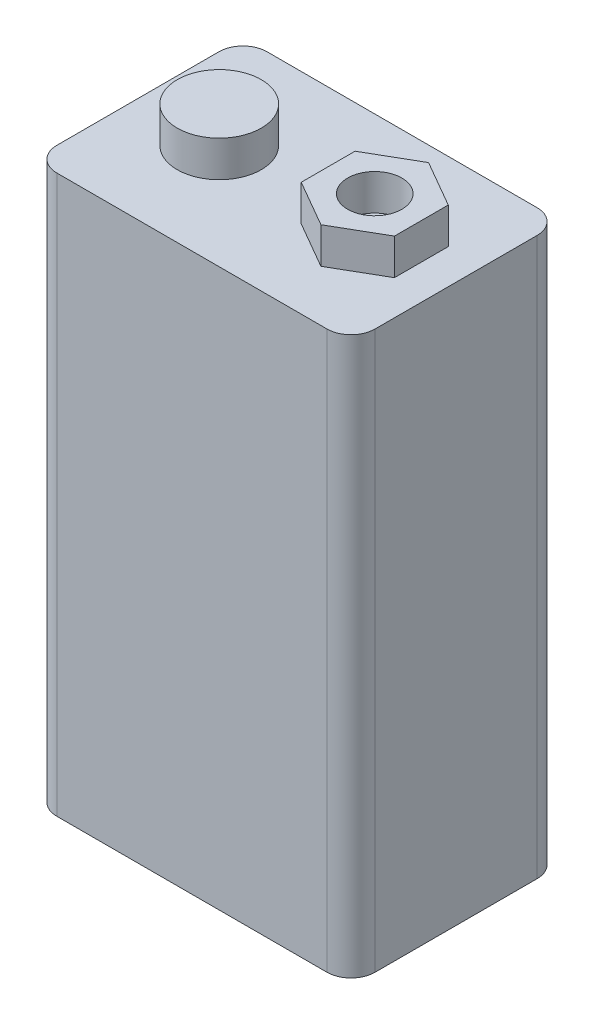
ISO-10303-21;
HEADER;
FILE_DESCRIPTION(('STEP AP214'),'2;1');
FILE_NAME('part.step','',(''),(''),'','','');
FILE_SCHEMA(('AUTOMOTIVE_DESIGN { 1 0 10303 214 1 1 1 1 }'));
ENDSEC;
DATA;
#1=APPLICATION_CONTEXT('core data for automotive mechanical design processes');
#2=APPLICATION_PROTOCOL_DEFINITION('international standard','automotive_design',2000,#1);
#3=PRODUCT_CONTEXT('',#1,'mechanical');
#4=PRODUCT('Part','Part','',(#3));
#5=PRODUCT_RELATED_PRODUCT_CATEGORY('part','',(#4));
#6=PRODUCT_DEFINITION_FORMATION('','',#4);
#7=PRODUCT_DEFINITION_CONTEXT('part definition',#1,'design');
#8=PRODUCT_DEFINITION('design','',#6,#7);
#9=PRODUCT_DEFINITION_SHAPE('','',#8);
#10=(LENGTH_UNIT() NAMED_UNIT(*) SI_UNIT(.MILLI.,.METRE.));
#11=(NAMED_UNIT(*) PLANE_ANGLE_UNIT() SI_UNIT($,.RADIAN.));
#12=(NAMED_UNIT(*) SI_UNIT($,.STERADIAN.) SOLID_ANGLE_UNIT());
#13=UNCERTAINTY_MEASURE_WITH_UNIT(LENGTH_MEASURE(1.E-05),#10,'distance_accuracy_value','');
#14=(GEOMETRIC_REPRESENTATION_CONTEXT(3) GLOBAL_UNCERTAINTY_ASSIGNED_CONTEXT((#13)) GLOBAL_UNIT_ASSIGNED_CONTEXT((#10,
#11,#12)) REPRESENTATION_CONTEXT('',''));
#15=CARTESIAN_POINT('',(0.,0.,0.));
#16=DIRECTION('',(0.,0.,1.));
#17=DIRECTION('',(1.,0.,0.));
#18=AXIS2_PLACEMENT_3D('',#15,#16,#17);
#19=CARTESIAN_POINT('',(11.25,46.4,6.75));
#20=DIRECTION('',(0.,1.,0.));
#21=DIRECTION('',(0.,0.,1.));
#22=AXIS2_PLACEMENT_3D('',#19,#20,#21);
#23=PLANE('',#22);
#24=CARTESIAN_POINT('',(-6.475,46.4,0.));
#25=DIRECTION('',(0.,1.,0.));
#26=DIRECTION('',(0.,0.,1.));
#27=AXIS2_PLACEMENT_3D('',#24,#25,#26);
#28=CIRCLE('',#27,3.5);
#29=CARTESIAN_POINT('',(-6.475,46.4,3.5));
#30=VERTEX_POINT('',#29);
#31=EDGE_CURVE('E229',#30,#30,#28,.T.);
#32=ORIENTED_EDGE('',*,*,#31,.F.);
#33=EDGE_LOOP('',(#32));
#34=FACE_BOUND('',#33,.T.);
#35=CARTESIAN_POINT('',(11.25,46.4,6.75));
#36=DIRECTION('',(0.,1.,0.));
#37=DIRECTION('',(0.,0.,1.));
#38=AXIS2_PLACEMENT_3D('',#35,#36,#37);
#39=CIRCLE('',#38,2.);
#40=CARTESIAN_POINT('',(11.25,46.4,8.75));
#41=VERTEX_POINT('',#40);
#42=CARTESIAN_POINT('',(13.25,46.4,6.74999999999999));
#43=VERTEX_POINT('',#42);
#44=EDGE_CURVE('E180',#41,#43,#39,.T.);
#45=ORIENTED_EDGE('',*,*,#44,.T.);
#46=DIRECTION('',(0.,0.,-1.));
#47=VECTOR('',#46,1.);
#48=CARTESIAN_POINT('',(13.25,46.4,6.74999999999999));
#49=LINE('',#48,#47);
#50=CARTESIAN_POINT('',(13.25,46.4,-6.74999999999999));
#51=VERTEX_POINT('',#50);
#52=EDGE_CURVE('E108',#43,#51,#49,.T.);
#53=ORIENTED_EDGE('',*,*,#52,.T.);
#54=CARTESIAN_POINT('',(11.25,46.4,-6.75));
#55=DIRECTION('',(0.,1.,0.));
#56=DIRECTION('',(0.,0.,-1.));
#57=AXIS2_PLACEMENT_3D('',#54,#55,#56);
#58=CIRCLE('',#57,2.);
#59=CARTESIAN_POINT('',(11.25,46.4,-8.75));
#60=VERTEX_POINT('',#59);
#61=EDGE_CURVE('E219',#51,#60,#58,.T.);
#62=ORIENTED_EDGE('',*,*,#61,.T.);
#63=DIRECTION('',(-1.,0.,0.));
#64=VECTOR('',#63,1.);
#65=CARTESIAN_POINT('',(-11.25,46.4,-8.75));
#66=LINE('',#65,#64);
#67=CARTESIAN_POINT('',(-11.25,46.4,-8.75));
#68=VERTEX_POINT('',#67);
#69=EDGE_CURVE('E217',#60,#68,#66,.T.);
#70=ORIENTED_EDGE('',*,*,#69,.T.);
#71=CARTESIAN_POINT('',(-11.25,46.4,-6.75));
#72=DIRECTION('',(0.,1.,0.));
#73=DIRECTION('',(0.,0.,-1.));
#74=AXIS2_PLACEMENT_3D('',#71,#72,#73);
#75=CIRCLE('',#74,2.);
#76=CARTESIAN_POINT('',(-13.25,46.4,-6.74999999999999));
#77=VERTEX_POINT('',#76);
#78=EDGE_CURVE('E131',#68,#77,#75,.T.);
#79=ORIENTED_EDGE('',*,*,#78,.T.);
#80=DIRECTION('',(0.,0.,1.));
#81=VECTOR('',#80,1.);
#82=CARTESIAN_POINT('',(-13.25,46.4,6.74999999999999));
#83=LINE('',#82,#81);
#84=CARTESIAN_POINT('',(-13.25,46.4,6.74999999999999));
#85=VERTEX_POINT('',#84);
#86=EDGE_CURVE('E124',#77,#85,#83,.T.);
#87=ORIENTED_EDGE('',*,*,#86,.T.);
#88=CARTESIAN_POINT('',(-11.25,46.4,6.75));
#89=DIRECTION('',(0.,1.,0.));
#90=DIRECTION('',(0.,0.,-1.));
#91=AXIS2_PLACEMENT_3D('',#88,#89,#90);
#92=CIRCLE('',#91,2.);
#93=CARTESIAN_POINT('',(-11.25,46.4,8.75));
#94=VERTEX_POINT('',#93);
#95=EDGE_CURVE('E128',#85,#94,#92,.T.);
#96=ORIENTED_EDGE('',*,*,#95,.T.);
#97=DIRECTION('',(1.,0.,0.));
#98=VECTOR('',#97,1.);
#99=CARTESIAN_POINT('',(-11.25,46.4,8.75));
#100=LINE('',#99,#98);
#101=EDGE_CURVE('E66',#94,#41,#100,.T.);
#102=ORIENTED_EDGE('',*,*,#101,.T.);
#103=EDGE_LOOP('',(#45,#53,#62,#70,#79,#87,#96,#102));
#104=FACE_BOUND('',#103,.T.);
#105=DIRECTION('',(0.,0.,1.));
#106=VECTOR('',#105,1.);
#107=CARTESIAN_POINT('',(2.59352091399951,46.4,0.));
#108=LINE('',#107,#106);
#109=CARTESIAN_POINT('',(2.59352091399951,46.4,-2.24097299515629));
#110=VERTEX_POINT('',#109);
#111=CARTESIAN_POINT('',(2.59352091399951,46.4,2.24097299515628));
#112=VERTEX_POINT('',#111);
#113=EDGE_CURVE('E274',#110,#112,#108,.T.);
#114=ORIENTED_EDGE('',*,*,#113,.F.);
#115=DIRECTION('',(-0.866025403784439,0.,0.5));
#116=VECTOR('',#115,1.);
#117=CARTESIAN_POINT('',(-0.321989543000246,46.4,-0.55770224798231));
#118=LINE('',#117,#116);
#119=CARTESIAN_POINT('',(6.475,46.4,-4.48194599031257));
#120=VERTEX_POINT('',#119);
#121=EDGE_CURVE('E278',#120,#110,#118,.T.);
#122=ORIENTED_EDGE('',*,*,#121,.F.);
#123=DIRECTION('',(-0.866025403784439,0.,-0.5));
#124=VECTOR('',#123,1.);
#125=CARTESIAN_POINT('',(3.55948954300024,46.4,-6.16521673748655));
#126=LINE('',#125,#124);
#127=CARTESIAN_POINT('',(10.3564790860005,46.4,-2.24097299515629));
#128=VERTEX_POINT('',#127);
#129=EDGE_CURVE('E259',#128,#120,#126,.T.);
#130=ORIENTED_EDGE('',*,*,#129,.F.);
#131=DIRECTION('',(0.,0.,-1.));
#132=VECTOR('',#131,1.);
#133=CARTESIAN_POINT('',(10.3564790860005,46.4,0.));
#134=LINE('',#133,#132);
#135=CARTESIAN_POINT('',(10.3564790860005,46.4,2.24097299515628));
#136=VERTEX_POINT('',#135);
#137=EDGE_CURVE('E263',#136,#128,#134,.T.);
#138=ORIENTED_EDGE('',*,*,#137,.F.);
#139=DIRECTION('',(0.866025403784439,0.,-0.5));
#140=VECTOR('',#139,1.);
#141=CARTESIAN_POINT('',(3.55948954300024,46.4,6.16521673748655));
#142=LINE('',#141,#140);
#143=CARTESIAN_POINT('',(6.475,46.4,4.48194599031257));
#144=VERTEX_POINT('',#143);
#145=EDGE_CURVE('E266',#144,#136,#142,.T.);
#146=ORIENTED_EDGE('',*,*,#145,.F.);
#147=DIRECTION('',(0.866025403784439,0.,0.5));
#148=VECTOR('',#147,1.);
#149=CARTESIAN_POINT('',(-0.321989543000244,46.4,0.557702247982307));
#150=LINE('',#149,#148);
#151=EDGE_CURVE('E270',#112,#144,#150,.T.);
#152=ORIENTED_EDGE('',*,*,#151,.F.);
#153=EDGE_LOOP('',(#114,#122,#130,#138,#146,#152));
#154=FACE_BOUND('',#153,.T.);
#155=ADVANCED_FACE('F41',(#34,#104,#154),#23,.T.);
#156=CARTESIAN_POINT('',(11.25,46.4,6.75));
#157=DIRECTION('',(0.,-1.,0.));
#158=DIRECTION('',(0.,0.,-1.));
#159=AXIS2_PLACEMENT_3D('',#156,#157,#158);
#160=CYLINDRICAL_SURFACE('',#159,2.);
#161=CARTESIAN_POINT('',(11.25,0.,6.75));
#162=DIRECTION('',(0.,1.,0.));
#163=DIRECTION('',(0.,0.,1.));
#164=AXIS2_PLACEMENT_3D('',#161,#162,#163);
#165=CIRCLE('',#164,2.);
#166=CARTESIAN_POINT('',(11.25,0.,8.75));
#167=VERTEX_POINT('',#166);
#168=CARTESIAN_POINT('',(13.25,0.,6.74999999999999));
#169=VERTEX_POINT('',#168);
#170=EDGE_CURVE('E156',#167,#169,#165,.T.);
#171=ORIENTED_EDGE('',*,*,#170,.T.);
#172=DIRECTION('',(0.,-1.,0.));
#173=VECTOR('',#172,1.);
#174=CARTESIAN_POINT('',(13.25,46.4,6.74999999999999));
#175=LINE('',#174,#173);
#176=EDGE_CURVE('E50',#43,#169,#175,.T.);
#177=ORIENTED_EDGE('',*,*,#176,.F.);
#178=ORIENTED_EDGE('',*,*,#44,.F.);
#179=DIRECTION('',(0.,-1.,0.));
#180=VECTOR('',#179,1.);
#181=CARTESIAN_POINT('',(11.25,46.4,8.75));
#182=LINE('',#181,#180);
#183=EDGE_CURVE('E152',#41,#167,#182,.T.);
#184=ORIENTED_EDGE('',*,*,#183,.T.);
#185=EDGE_LOOP('',(#171,#177,#178,#184));
#186=FACE_BOUND('',#185,.T.);
#187=ADVANCED_FACE('F43',(#186),#160,.T.);
#188=CARTESIAN_POINT('',(13.25,46.4,6.74999999999999));
#189=DIRECTION('',(-1.,0.,0.));
#190=DIRECTION('',(0.,0.,1.));
#191=AXIS2_PLACEMENT_3D('',#188,#189,#190);
#192=PLANE('',#191);
#193=DIRECTION('',(0.,0.,-1.));
#194=VECTOR('',#193,1.);
#195=CARTESIAN_POINT('',(13.25,0.,6.74999999999999));
#196=LINE('',#195,#194);
#197=CARTESIAN_POINT('',(13.25,0.,-6.74999999999999));
#198=VERTEX_POINT('',#197);
#199=EDGE_CURVE('E160',#169,#198,#196,.T.);
#200=ORIENTED_EDGE('',*,*,#199,.T.);
#201=DIRECTION('',(0.,-1.,0.));
#202=VECTOR('',#201,1.);
#203=CARTESIAN_POINT('',(13.25,46.4,-6.74999999999999));
#204=LINE('',#203,#202);
#205=EDGE_CURVE('E195',#51,#198,#204,.T.);
#206=ORIENTED_EDGE('',*,*,#205,.F.);
#207=ORIENTED_EDGE('',*,*,#52,.F.);
#208=ORIENTED_EDGE('',*,*,#176,.T.);
#209=EDGE_LOOP('',(#200,#206,#207,#208));
#210=FACE_BOUND('',#209,.T.);
#211=ADVANCED_FACE('F200',(#210),#192,.F.);
#212=CARTESIAN_POINT('',(11.25,46.4,-6.75));
#213=DIRECTION('',(0.,-1.,0.));
#214=DIRECTION('',(0.,0.,-1.));
#215=AXIS2_PLACEMENT_3D('',#212,#213,#214);
#216=CYLINDRICAL_SURFACE('',#215,2.);
#217=CARTESIAN_POINT('',(11.25,0.,-6.75));
#218=DIRECTION('',(0.,1.,0.));
#219=DIRECTION('',(0.,0.,-1.));
#220=AXIS2_PLACEMENT_3D('',#217,#218,#219);
#221=CIRCLE('',#220,2.);
#222=CARTESIAN_POINT('',(11.25,0.,-8.75));
#223=VERTEX_POINT('',#222);
#224=EDGE_CURVE('E164',#198,#223,#221,.T.);
#225=ORIENTED_EDGE('',*,*,#224,.T.);
#226=DIRECTION('',(0.,-1.,0.));
#227=VECTOR('',#226,1.);
#228=CARTESIAN_POINT('',(11.25,46.4,-8.75));
#229=LINE('',#228,#227);
#230=EDGE_CURVE('E191',#60,#223,#229,.T.);
#231=ORIENTED_EDGE('',*,*,#230,.F.);
#232=ORIENTED_EDGE('',*,*,#61,.F.);
#233=ORIENTED_EDGE('',*,*,#205,.T.);
#234=EDGE_LOOP('',(#225,#231,#232,#233));
#235=FACE_BOUND('',#234,.T.);
#236=ADVANCED_FACE('F211',(#235),#216,.T.);
#237=CARTESIAN_POINT('',(-11.25,46.4,-8.75));
#238=DIRECTION('',(0.,0.,1.));
#239=DIRECTION('',(1.,0.,0.));
#240=AXIS2_PLACEMENT_3D('',#237,#238,#239);
#241=PLANE('',#240);
#242=DIRECTION('',(-1.,0.,0.));
#243=VECTOR('',#242,1.);
#244=CARTESIAN_POINT('',(-11.25,0.,-8.75));
#245=LINE('',#244,#243);
#246=CARTESIAN_POINT('',(-11.25,0.,-8.75));
#247=VERTEX_POINT('',#246);
#248=EDGE_CURVE('E167',#223,#247,#245,.T.);
#249=ORIENTED_EDGE('',*,*,#248,.T.);
#250=DIRECTION('',(0.,-1.,0.));
#251=VECTOR('',#250,1.);
#252=CARTESIAN_POINT('',(-11.25,46.4,-8.75));
#253=LINE('',#252,#251);
#254=EDGE_CURVE('E187',#68,#247,#253,.T.);
#255=ORIENTED_EDGE('',*,*,#254,.F.);
#256=ORIENTED_EDGE('',*,*,#69,.F.);
#257=ORIENTED_EDGE('',*,*,#230,.T.);
#258=EDGE_LOOP('',(#249,#255,#256,#257));
#259=FACE_BOUND('',#258,.T.);
#260=ADVANCED_FACE('F215',(#259),#241,.F.);
#261=CARTESIAN_POINT('',(-11.25,46.4,-6.75));
#262=DIRECTION('',(0.,-1.,0.));
#263=DIRECTION('',(0.,0.,-1.));
#264=AXIS2_PLACEMENT_3D('',#261,#262,#263);
#265=CYLINDRICAL_SURFACE('',#264,2.);
#266=CARTESIAN_POINT('',(-11.25,0.,-6.75));
#267=DIRECTION('',(0.,1.,0.));
#268=DIRECTION('',(0.,0.,-1.));
#269=AXIS2_PLACEMENT_3D('',#266,#267,#268);
#270=CIRCLE('',#269,2.);
#271=CARTESIAN_POINT('',(-13.25,0.,-6.74999999999999));
#272=VERTEX_POINT('',#271);
#273=EDGE_CURVE('E170',#247,#272,#270,.T.);
#274=ORIENTED_EDGE('',*,*,#273,.T.);
#275=DIRECTION('',(0.,-1.,0.));
#276=VECTOR('',#275,1.);
#277=CARTESIAN_POINT('',(-13.25,46.4,-6.74999999999999));
#278=LINE('',#277,#276);
#279=EDGE_CURVE('E145',#77,#272,#278,.T.);
#280=ORIENTED_EDGE('',*,*,#279,.F.);
#281=ORIENTED_EDGE('',*,*,#78,.F.);
#282=ORIENTED_EDGE('',*,*,#254,.T.);
#283=EDGE_LOOP('',(#274,#280,#281,#282));
#284=FACE_BOUND('',#283,.T.);
#285=ADVANCED_FACE('F488',(#284),#265,.T.);
#286=CARTESIAN_POINT('',(-13.25,46.4,6.74999999999999));
#287=DIRECTION('',(1.,0.,0.));
#288=DIRECTION('',(0.,0.,-1.));
#289=AXIS2_PLACEMENT_3D('',#286,#287,#288);
#290=PLANE('',#289);
#291=DIRECTION('',(0.,0.,1.));
#292=VECTOR('',#291,1.);
#293=CARTESIAN_POINT('',(-13.25,0.,6.74999999999999));
#294=LINE('',#293,#292);
#295=CARTESIAN_POINT('',(-13.25,0.,6.74999999999999));
#296=VERTEX_POINT('',#295);
#297=EDGE_CURVE('E141',#272,#296,#294,.T.);
#298=ORIENTED_EDGE('',*,*,#297,.T.);
#299=DIRECTION('',(0.,-1.,0.));
#300=VECTOR('',#299,1.);
#301=CARTESIAN_POINT('',(-13.25,46.4,6.74999999999999));
#302=LINE('',#301,#300);
#303=EDGE_CURVE('E138',#85,#296,#302,.T.);
#304=ORIENTED_EDGE('',*,*,#303,.F.);
#305=ORIENTED_EDGE('',*,*,#86,.F.);
#306=ORIENTED_EDGE('',*,*,#279,.T.);
#307=EDGE_LOOP('',(#298,#304,#305,#306));
#308=FACE_BOUND('',#307,.T.);
#309=ADVANCED_FACE('F139',(#308),#290,.F.);
#310=CARTESIAN_POINT('',(-11.25,46.4,6.75));
#311=DIRECTION('',(0.,-1.,0.));
#312=DIRECTION('',(0.,0.,-1.));
#313=AXIS2_PLACEMENT_3D('',#310,#311,#312);
#314=CYLINDRICAL_SURFACE('',#313,2.);
#315=CARTESIAN_POINT('',(-11.25,0.,6.75));
#316=DIRECTION('',(0.,1.,0.));
#317=DIRECTION('',(0.,0.,-1.));
#318=AXIS2_PLACEMENT_3D('',#315,#316,#317);
#319=CIRCLE('',#318,2.);
#320=CARTESIAN_POINT('',(-11.25,0.,8.75));
#321=VERTEX_POINT('',#320);
#322=EDGE_CURVE('E175',#296,#321,#319,.T.);
#323=ORIENTED_EDGE('',*,*,#322,.T.);
#324=DIRECTION('',(0.,-1.,0.));
#325=VECTOR('',#324,1.);
#326=CARTESIAN_POINT('',(-11.25,46.4,8.75));
#327=LINE('',#326,#325);
#328=EDGE_CURVE('E146',#94,#321,#327,.T.);
#329=ORIENTED_EDGE('',*,*,#328,.F.);
#330=ORIENTED_EDGE('',*,*,#95,.F.);
#331=ORIENTED_EDGE('',*,*,#303,.T.);
#332=EDGE_LOOP('',(#323,#329,#330,#331));
#333=FACE_BOUND('',#332,.T.);
#334=ADVANCED_FACE('F148',(#333),#314,.T.);
#335=CARTESIAN_POINT('',(-11.25,46.4,8.75));
#336=DIRECTION('',(0.,0.,-1.));
#337=DIRECTION('',(-1.,0.,0.));
#338=AXIS2_PLACEMENT_3D('',#335,#336,#337);
#339=PLANE('',#338);
#340=DIRECTION('',(1.,0.,0.));
#341=VECTOR('',#340,1.);
#342=CARTESIAN_POINT('',(-11.25,0.,8.75));
#343=LINE('',#342,#341);
#344=EDGE_CURVE('E99',#321,#167,#343,.T.);
#345=ORIENTED_EDGE('',*,*,#344,.T.);
#346=ORIENTED_EDGE('',*,*,#183,.F.);
#347=ORIENTED_EDGE('',*,*,#101,.F.);
#348=ORIENTED_EDGE('',*,*,#328,.T.);
#349=EDGE_LOOP('',(#345,#346,#347,#348));
#350=FACE_BOUND('',#349,.T.);
#351=ADVANCED_FACE('F464',(#350),#339,.F.);
#352=CARTESIAN_POINT('',(11.25,0.,6.75));
#353=DIRECTION('',(0.,1.,0.));
#354=DIRECTION('',(0.,0.,1.));
#355=AXIS2_PLACEMENT_3D('',#352,#353,#354);
#356=PLANE('',#355);
#357=ORIENTED_EDGE('',*,*,#170,.F.);
#358=ORIENTED_EDGE('',*,*,#344,.F.);
#359=ORIENTED_EDGE('',*,*,#322,.F.);
#360=ORIENTED_EDGE('',*,*,#297,.F.);
#361=ORIENTED_EDGE('',*,*,#273,.F.);
#362=ORIENTED_EDGE('',*,*,#248,.F.);
#363=ORIENTED_EDGE('',*,*,#224,.F.);
#364=ORIENTED_EDGE('',*,*,#199,.F.);
#365=EDGE_LOOP('',(#357,#358,#359,#360,#361,#362,#363,#364));
#366=FACE_BOUND('',#365,.T.);
#367=ADVANCED_FACE('F205',(#366),#356,.F.);
#368=CARTESIAN_POINT('',(-6.475,49.4,0.));
#369=DIRECTION('',(0.,-1.,0.));
#370=DIRECTION('',(0.,0.,-1.));
#371=AXIS2_PLACEMENT_3D('',#368,#369,#370);
#372=CYLINDRICAL_SURFACE('',#371,3.5);
#373=CARTESIAN_POINT('',(-6.475,49.4,0.));
#374=DIRECTION('',(0.,1.,0.));
#375=DIRECTION('',(0.,0.,1.));
#376=AXIS2_PLACEMENT_3D('',#373,#374,#375);
#377=CIRCLE('',#376,3.5);
#378=CARTESIAN_POINT('',(-6.475,49.4,3.5));
#379=VERTEX_POINT('',#378);
#380=EDGE_CURVE('E161',#379,#379,#377,.T.);
#381=ORIENTED_EDGE('',*,*,#380,.F.);
#382=EDGE_LOOP('',(#381));
#383=FACE_BOUND('',#382,.T.);
#384=ORIENTED_EDGE('',*,*,#31,.T.);
#385=EDGE_LOOP('',(#384));
#386=FACE_BOUND('',#385,.T.);
#387=ADVANCED_FACE('F442',(#383,#386),#372,.T.);
#388=CARTESIAN_POINT('',(0.,49.4,0.));
#389=DIRECTION('',(0.,1.,0.));
#390=DIRECTION('',(0.,0.,1.));
#391=AXIS2_PLACEMENT_3D('',#388,#389,#390);
#392=PLANE('',#391);
#393=ORIENTED_EDGE('',*,*,#380,.T.);
#394=EDGE_LOOP('',(#393));
#395=FACE_BOUND('',#394,.T.);
#396=ADVANCED_FACE('F433',(#395),#392,.T.);
#397=CARTESIAN_POINT('',(-0.321989543000246,49.4,-0.55770224798231));
#398=DIRECTION('',(0.5,0.,0.866025403784439));
#399=DIRECTION('',(0.866025403784439,0.,-0.5));
#400=AXIS2_PLACEMENT_3D('',#397,#398,#399);
#401=PLANE('',#400);
#402=ORIENTED_EDGE('',*,*,#121,.T.);
#403=DIRECTION('',(0.,-1.,0.));
#404=VECTOR('',#403,1.);
#405=CARTESIAN_POINT('',(2.59352091399951,49.4,-2.24097299515629));
#406=LINE('',#405,#404);
#407=CARTESIAN_POINT('',(2.59352091399951,49.4,-2.24097299515629));
#408=VERTEX_POINT('',#407);
#409=EDGE_CURVE('E233',#408,#110,#406,.T.);
#410=ORIENTED_EDGE('',*,*,#409,.F.);
#411=DIRECTION('',(-0.866025403784439,0.,0.5));
#412=VECTOR('',#411,1.);
#413=CARTESIAN_POINT('',(-0.321989543000246,49.4,-0.55770224798231));
#414=LINE('',#413,#412);
#415=CARTESIAN_POINT('',(6.475,49.4,-4.48194599031257));
#416=VERTEX_POINT('',#415);
#417=EDGE_CURVE('E301',#416,#408,#414,.T.);
#418=ORIENTED_EDGE('',*,*,#417,.F.);
#419=DIRECTION('',(0.,-1.,0.));
#420=VECTOR('',#419,1.);
#421=CARTESIAN_POINT('',(6.475,49.4,-4.48194599031257));
#422=LINE('',#421,#420);
#423=EDGE_CURVE('E254',#416,#120,#422,.T.);
#424=ORIENTED_EDGE('',*,*,#423,.T.);
#425=EDGE_LOOP('',(#402,#410,#418,#424));
#426=FACE_BOUND('',#425,.T.);
#427=ADVANCED_FACE('F327',(#426),#401,.F.);
#428=CARTESIAN_POINT('',(2.59352091399951,49.4,0.));
#429=DIRECTION('',(1.,0.,0.));
#430=DIRECTION('',(0.,0.,-1.));
#431=AXIS2_PLACEMENT_3D('',#428,#429,#430);
#432=PLANE('',#431);
#433=ORIENTED_EDGE('',*,*,#113,.T.);
#434=DIRECTION('',(0.,-1.,0.));
#435=VECTOR('',#434,1.);
#436=CARTESIAN_POINT('',(2.59352091399951,49.4,2.24097299515628));
#437=LINE('',#436,#435);
#438=CARTESIAN_POINT('',(2.59352091399951,49.4,2.24097299515628));
#439=VERTEX_POINT('',#438);
#440=EDGE_CURVE('E240',#439,#112,#437,.T.);
#441=ORIENTED_EDGE('',*,*,#440,.F.);
#442=DIRECTION('',(0.,0.,1.));
#443=VECTOR('',#442,1.);
#444=CARTESIAN_POINT('',(2.59352091399951,49.4,0.));
#445=LINE('',#444,#443);
#446=EDGE_CURVE('E297',#408,#439,#445,.T.);
#447=ORIENTED_EDGE('',*,*,#446,.F.);
#448=ORIENTED_EDGE('',*,*,#409,.T.);
#449=EDGE_LOOP('',(#433,#441,#447,#448));
#450=FACE_BOUND('',#449,.T.);
#451=ADVANCED_FACE('F332',(#450),#432,.F.);
#452=CARTESIAN_POINT('',(-0.321989543000244,49.4,0.557702247982307));
#453=DIRECTION('',(0.5,0.,-0.866025403784439));
#454=DIRECTION('',(-0.866025403784439,0.,-0.5));
#455=AXIS2_PLACEMENT_3D('',#452,#453,#454);
#456=PLANE('',#455);
#457=ORIENTED_EDGE('',*,*,#151,.T.);
#458=DIRECTION('',(0.,-1.,0.));
#459=VECTOR('',#458,1.);
#460=CARTESIAN_POINT('',(6.475,49.4,4.48194599031257));
#461=LINE('',#460,#459);
#462=CARTESIAN_POINT('',(6.475,49.4,4.48194599031257));
#463=VERTEX_POINT('',#462);
#464=EDGE_CURVE('E244',#463,#144,#461,.T.);
#465=ORIENTED_EDGE('',*,*,#464,.F.);
#466=DIRECTION('',(0.866025403784439,0.,0.5));
#467=VECTOR('',#466,1.);
#468=CARTESIAN_POINT('',(-0.321989543000244,49.4,0.557702247982307));
#469=LINE('',#468,#467);
#470=EDGE_CURVE('E293',#439,#463,#469,.T.);
#471=ORIENTED_EDGE('',*,*,#470,.F.);
#472=ORIENTED_EDGE('',*,*,#440,.T.);
#473=EDGE_LOOP('',(#457,#465,#471,#472));
#474=FACE_BOUND('',#473,.T.);
#475=ADVANCED_FACE('F349',(#474),#456,.F.);
#476=CARTESIAN_POINT('',(3.55948954300024,49.4,6.16521673748655));
#477=DIRECTION('',(-0.5,0.,-0.866025403784439));
#478=DIRECTION('',(-0.866025403784439,0.,0.5));
#479=AXIS2_PLACEMENT_3D('',#476,#477,#478);
#480=PLANE('',#479);
#481=ORIENTED_EDGE('',*,*,#145,.T.);
#482=DIRECTION('',(0.,-1.,0.));
#483=VECTOR('',#482,1.);
#484=CARTESIAN_POINT('',(10.3564790860005,49.4,2.24097299515628));
#485=LINE('',#484,#483);
#486=CARTESIAN_POINT('',(10.3564790860005,49.4,2.24097299515628));
#487=VERTEX_POINT('',#486);
#488=EDGE_CURVE('E248',#487,#136,#485,.T.);
#489=ORIENTED_EDGE('',*,*,#488,.F.);
#490=DIRECTION('',(0.866025403784439,0.,-0.5));
#491=VECTOR('',#490,1.);
#492=CARTESIAN_POINT('',(3.55948954300024,49.4,6.16521673748655));
#493=LINE('',#492,#491);
#494=EDGE_CURVE('E289',#463,#487,#493,.T.);
#495=ORIENTED_EDGE('',*,*,#494,.F.);
#496=ORIENTED_EDGE('',*,*,#464,.T.);
#497=EDGE_LOOP('',(#481,#489,#495,#496));
#498=FACE_BOUND('',#497,.T.);
#499=ADVANCED_FACE('F353',(#498),#480,.F.);
#500=CARTESIAN_POINT('',(10.3564790860005,49.4,0.));
#501=DIRECTION('',(-1.,0.,0.));
#502=DIRECTION('',(0.,0.,1.));
#503=AXIS2_PLACEMENT_3D('',#500,#501,#502);
#504=PLANE('',#503);
#505=ORIENTED_EDGE('',*,*,#137,.T.);
#506=DIRECTION('',(0.,-1.,0.));
#507=VECTOR('',#506,1.);
#508=CARTESIAN_POINT('',(10.3564790860005,49.4,-2.24097299515629));
#509=LINE('',#508,#507);
#510=CARTESIAN_POINT('',(10.3564790860005,49.4,-2.24097299515629));
#511=VERTEX_POINT('',#510);
#512=EDGE_CURVE('E57',#511,#128,#509,.T.);
#513=ORIENTED_EDGE('',*,*,#512,.F.);
#514=DIRECTION('',(0.,0.,-1.));
#515=VECTOR('',#514,1.);
#516=CARTESIAN_POINT('',(10.3564790860005,49.4,0.));
#517=LINE('',#516,#515);
#518=EDGE_CURVE('E285',#487,#511,#517,.T.);
#519=ORIENTED_EDGE('',*,*,#518,.F.);
#520=ORIENTED_EDGE('',*,*,#488,.T.);
#521=EDGE_LOOP('',(#505,#513,#519,#520));
#522=FACE_BOUND('',#521,.T.);
#523=ADVANCED_FACE('F361',(#522),#504,.F.);
#524=CARTESIAN_POINT('',(6.475,49.4,0.));
#525=DIRECTION('',(0.,-1.,0.));
#526=DIRECTION('',(0.,0.,-1.));
#527=AXIS2_PLACEMENT_3D('',#524,#525,#526);
#528=CYLINDRICAL_SURFACE('',#527,2.2593151179506);
#529=CARTESIAN_POINT('',(6.475,49.4,0.));
#530=DIRECTION('',(0.,1.,0.));
#531=DIRECTION('',(0.,0.,1.));
#532=AXIS2_PLACEMENT_3D('',#529,#530,#531);
#533=CIRCLE('',#532,2.2593151179506);
#534=CARTESIAN_POINT('',(6.475,49.4,2.2593151179506));
#535=VERTEX_POINT('',#534);
#536=EDGE_CURVE('E262',#535,#535,#533,.T.);
#537=ORIENTED_EDGE('',*,*,#536,.T.);
#538=EDGE_LOOP('',(#537));
#539=FACE_BOUND('',#538,.T.);
#540=CARTESIAN_POINT('',(6.475,46.4,0.));
#541=DIRECTION('',(0.,1.,0.));
#542=DIRECTION('',(0.,0.,1.));
#543=AXIS2_PLACEMENT_3D('',#540,#541,#542);
#544=CIRCLE('',#543,2.2593151179506);
#545=CARTESIAN_POINT('',(6.475,46.4,2.2593151179506));
#546=VERTEX_POINT('',#545);
#547=EDGE_CURVE('E11',#546,#546,#544,.F.);
#548=ORIENTED_EDGE('',*,*,#547,.T.);
#549=EDGE_LOOP('',(#548));
#550=FACE_BOUND('',#549,.T.);
#551=ADVANCED_FACE('F309',(#539,#550),#528,.F.);
#552=CARTESIAN_POINT('',(3.55948954300024,49.4,-6.16521673748655));
#553=DIRECTION('',(-0.5,0.,0.866025403784439));
#554=DIRECTION('',(0.866025403784439,0.,0.5));
#555=AXIS2_PLACEMENT_3D('',#552,#553,#554);
#556=PLANE('',#555);
#557=ORIENTED_EDGE('',*,*,#129,.T.);
#558=ORIENTED_EDGE('',*,*,#423,.F.);
#559=DIRECTION('',(-0.866025403784439,0.,-0.5));
#560=VECTOR('',#559,1.);
#561=CARTESIAN_POINT('',(3.55948954300024,49.4,-6.16521673748655));
#562=LINE('',#561,#560);
#563=EDGE_CURVE('E258',#511,#416,#562,.T.);
#564=ORIENTED_EDGE('',*,*,#563,.F.);
#565=ORIENTED_EDGE('',*,*,#512,.T.);
#566=EDGE_LOOP('',(#557,#558,#564,#565));
#567=FACE_BOUND('',#566,.T.);
#568=ADVANCED_FACE('F316',(#567),#556,.F.);
#569=CARTESIAN_POINT('',(0.,49.4,0.));
#570=DIRECTION('',(0.,1.,0.));
#571=DIRECTION('',(0.,0.,1.));
#572=AXIS2_PLACEMENT_3D('',#569,#570,#571);
#573=PLANE('',#572);
#574=ORIENTED_EDGE('',*,*,#536,.F.);
#575=EDGE_LOOP('',(#574));
#576=FACE_BOUND('',#575,.T.);
#577=ORIENTED_EDGE('',*,*,#417,.T.);
#578=ORIENTED_EDGE('',*,*,#446,.T.);
#579=ORIENTED_EDGE('',*,*,#470,.T.);
#580=ORIENTED_EDGE('',*,*,#494,.T.);
#581=ORIENTED_EDGE('',*,*,#518,.T.);
#582=ORIENTED_EDGE('',*,*,#563,.T.);
#583=EDGE_LOOP('',(#577,#578,#579,#580,#581,#582));
#584=FACE_BOUND('',#583,.T.);
#585=ADVANCED_FACE('F312',(#576,#584),#573,.T.);
#586=ORIENTED_EDGE('',*,*,#547,.F.);
#587=EDGE_LOOP('',(#586));
#588=FACE_BOUND('',#587,.T.);
#589=ADVANCED_FACE('F315',(#588),#23,.T.);
#590=CLOSED_SHELL('',(#155,#187,#211,#236,#260,#285,#309,#334,#351,#367,#387,#396,#427,#451,
#475,#499,#523,#551,#568,#585,#589));
#591=MANIFOLD_SOLID_BREP('B2',#590);
#592=ADVANCED_BREP_SHAPE_REPRESENTATION('',(#18,#591),#14);
#593=SHAPE_DEFINITION_REPRESENTATION(#9,#592);
ENDSEC;
END-ISO-10303-21;
